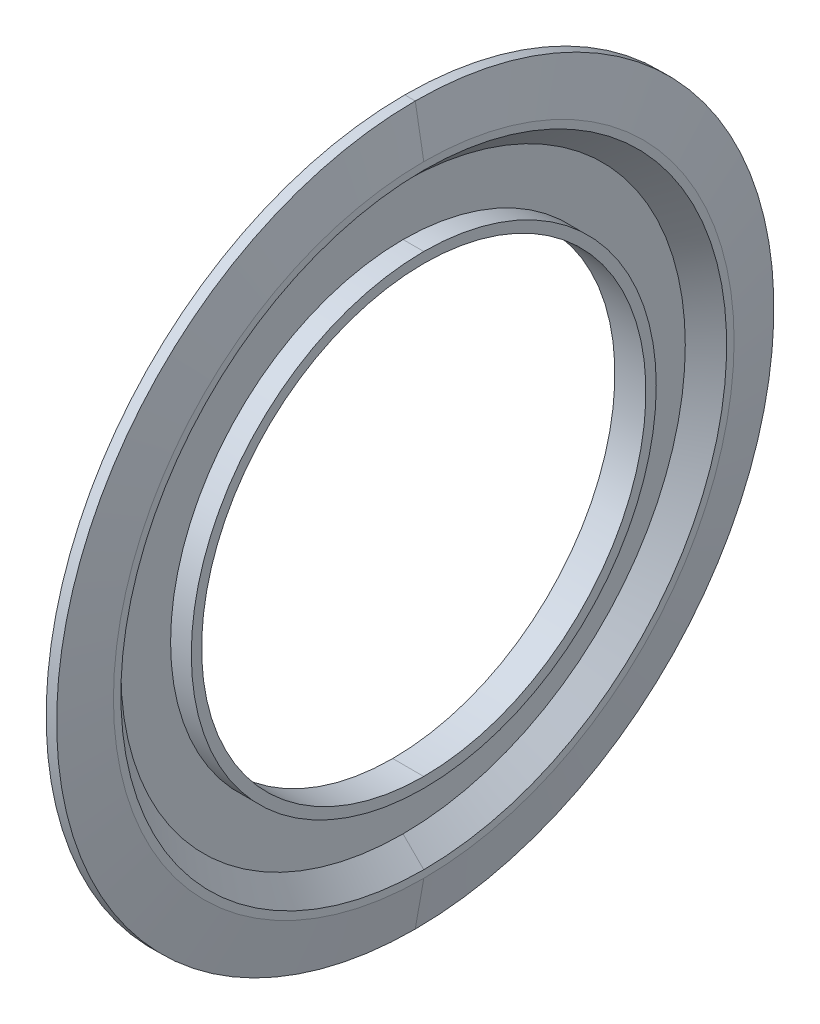
ISO-10303-21;
HEADER;
FILE_DESCRIPTION(('STEP AP214'),'2;1');
FILE_NAME('part.step','',(''),(''),'','','');
FILE_SCHEMA(('AUTOMOTIVE_DESIGN { 1 0 10303 214 1 1 1 1 }'));
ENDSEC;
DATA;
#1=APPLICATION_CONTEXT('core data for automotive mechanical design processes');
#2=APPLICATION_PROTOCOL_DEFINITION('international standard','automotive_design',2000,#1);
#3=PRODUCT_CONTEXT('',#1,'mechanical');
#4=PRODUCT('Part','Part','',(#3));
#5=PRODUCT_RELATED_PRODUCT_CATEGORY('part','',(#4));
#6=PRODUCT_DEFINITION_FORMATION('','',#4);
#7=PRODUCT_DEFINITION_CONTEXT('part definition',#1,'design');
#8=PRODUCT_DEFINITION('design','',#6,#7);
#9=PRODUCT_DEFINITION_SHAPE('','',#8);
#10=(LENGTH_UNIT() NAMED_UNIT(*) SI_UNIT(.MILLI.,.METRE.));
#11=(NAMED_UNIT(*) PLANE_ANGLE_UNIT() SI_UNIT($,.RADIAN.));
#12=(NAMED_UNIT(*) SI_UNIT($,.STERADIAN.) SOLID_ANGLE_UNIT());
#13=UNCERTAINTY_MEASURE_WITH_UNIT(LENGTH_MEASURE(1.E-05),#10,'distance_accuracy_value','');
#14=(GEOMETRIC_REPRESENTATION_CONTEXT(3) GLOBAL_UNCERTAINTY_ASSIGNED_CONTEXT((#13)) GLOBAL_UNIT_ASSIGNED_CONTEXT((#10,
#11,#12)) REPRESENTATION_CONTEXT('',''));
#15=CARTESIAN_POINT('',(0.,0.,0.));
#16=DIRECTION('',(0.,0.,1.));
#17=DIRECTION('',(1.,0.,0.));
#18=AXIS2_PLACEMENT_3D('',#15,#16,#17);
#19=CARTESIAN_POINT('',(0.762871315483505,5.78,0.));
#20=DIRECTION('',(1.,0.,0.));
#21=DIRECTION('',(0.,0.,1.));
#22=AXIS2_PLACEMENT_3D('',#19,#20,#21);
#23=PLANE('',#22);
#24=CARTESIAN_POINT('',(0.762871315483505,0.,0.));
#25=DIRECTION('',(-1.,0.,0.));
#26=DIRECTION('',(0.,1.,0.));
#27=AXIS2_PLACEMENT_3D('',#24,#25,#26);
#28=CIRCLE('',#27,5.71);
#29=CARTESIAN_POINT('',(0.762871315483505,5.71,0.));
#30=VERTEX_POINT('',#29);
#31=CARTESIAN_POINT('',(0.762871315483505,-5.71,0.));
#32=VERTEX_POINT('',#31);
#33=EDGE_CURVE('E11',#30,#32,#28,.T.);
#34=ORIENTED_EDGE('',*,*,#33,.T.);
#35=CARTESIAN_POINT('',(0.762871315483505,0.,0.));
#36=DIRECTION('',(-1.,0.,0.));
#37=DIRECTION('',(0.,1.,0.));
#38=AXIS2_PLACEMENT_3D('',#35,#36,#37);
#39=CIRCLE('',#38,5.71);
#40=EDGE_CURVE('E110',#32,#30,#39,.T.);
#41=ORIENTED_EDGE('',*,*,#40,.T.);
#42=EDGE_LOOP('',(#34,#41));
#43=FACE_BOUND('',#42,.T.);
#44=CARTESIAN_POINT('',(0.762871315483505,0.,0.));
#45=DIRECTION('',(-1.,0.,0.));
#46=DIRECTION('',(0.,1.,0.));
#47=AXIS2_PLACEMENT_3D('',#44,#45,#46);
#48=CIRCLE('',#47,5.85);
#49=CARTESIAN_POINT('',(0.762871315483505,5.85,0.));
#50=VERTEX_POINT('',#49);
#51=CARTESIAN_POINT('',(0.762871315483505,-5.85,0.));
#52=VERTEX_POINT('',#51);
#53=EDGE_CURVE('E188',#50,#52,#48,.T.);
#54=ORIENTED_EDGE('',*,*,#53,.F.);
#55=CARTESIAN_POINT('',(0.762871315483505,0.,0.));
#56=DIRECTION('',(-1.,0.,0.));
#57=DIRECTION('',(0.,1.,0.));
#58=AXIS2_PLACEMENT_3D('',#55,#56,#57);
#59=CIRCLE('',#58,5.85);
#60=EDGE_CURVE('E30',#52,#50,#59,.T.);
#61=ORIENTED_EDGE('',*,*,#60,.F.);
#62=EDGE_LOOP('',(#54,#61));
#63=FACE_BOUND('',#62,.T.);
#64=ADVANCED_FACE('F16',(#43,#63),#23,.T.);
#65=CARTESIAN_POINT('',(0.567871315483504,0.,0.));
#66=DIRECTION('',(1.,0.,0.));
#67=DIRECTION('',(0.,1.,0.));
#68=AXIS2_PLACEMENT_3D('',#65,#66,#67);
#69=CONICAL_SURFACE('',#68,5.515,0.785398163397448);
#70=DIRECTION('',(-0.707106781186548,-0.707106781186547,0.));
#71=VECTOR('',#70,1.);
#72=CARTESIAN_POINT('',(0.567871315483504,5.515,0.));
#73=LINE('',#72,#71);
#74=CARTESIAN_POINT('',(0.372871315483505,5.32,0.));
#75=VERTEX_POINT('',#74);
#76=EDGE_CURVE('E105',#30,#75,#73,.T.);
#77=ORIENTED_EDGE('',*,*,#76,.T.);
#78=CARTESIAN_POINT('',(0.372871315483505,0.,0.));
#79=DIRECTION('',(-1.,0.,0.));
#80=DIRECTION('',(0.,1.,0.));
#81=AXIS2_PLACEMENT_3D('',#78,#79,#80);
#82=CIRCLE('',#81,5.32);
#83=CARTESIAN_POINT('',(0.372871315483505,-5.32,0.));
#84=VERTEX_POINT('',#83);
#85=EDGE_CURVE('E19',#75,#84,#82,.T.);
#86=ORIENTED_EDGE('',*,*,#85,.T.);
#87=DIRECTION('',(0.707106781186548,-0.707106781186547,0.));
#88=VECTOR('',#87,1.);
#89=CARTESIAN_POINT('',(0.567871315483504,-5.515,0.));
#90=LINE('',#89,#88);
#91=EDGE_CURVE('E107',#84,#32,#90,.T.);
#92=ORIENTED_EDGE('',*,*,#91,.T.);
#93=ORIENTED_EDGE('',*,*,#33,.F.);
#94=EDGE_LOOP('',(#77,#86,#92,#93));
#95=FACE_BOUND('',#94,.T.);
#96=ADVANCED_FACE('F103',(#95),#69,.F.);
#97=CARTESIAN_POINT('',(0.372871315483504,4.85125,0.));
#98=DIRECTION('',(1.,0.,0.));
#99=DIRECTION('',(0.,-1.,0.));
#100=AXIS2_PLACEMENT_3D('',#97,#98,#99);
#101=PLANE('',#100);
#102=CARTESIAN_POINT('',(0.372871315483504,0.,0.));
#103=DIRECTION('',(-1.,0.,0.));
#104=DIRECTION('',(0.,1.,0.));
#105=AXIS2_PLACEMENT_3D('',#102,#103,#104);
#106=CIRCLE('',#105,4.3825);
#107=CARTESIAN_POINT('',(0.372871315483504,4.3825,0.));
#108=VERTEX_POINT('',#107);
#109=CARTESIAN_POINT('',(0.372871315483504,-4.3825,0.));
#110=VERTEX_POINT('',#109);
#111=EDGE_CURVE('E149',#108,#110,#106,.T.);
#112=ORIENTED_EDGE('',*,*,#111,.T.);
#113=CARTESIAN_POINT('',(0.372871315483504,0.,0.));
#114=DIRECTION('',(-1.,0.,0.));
#115=DIRECTION('',(0.,1.,0.));
#116=AXIS2_PLACEMENT_3D('',#113,#114,#115);
#117=CIRCLE('',#116,4.3825);
#118=EDGE_CURVE('E201',#110,#108,#117,.T.);
#119=ORIENTED_EDGE('',*,*,#118,.T.);
#120=EDGE_LOOP('',(#112,#119));
#121=FACE_BOUND('',#120,.T.);
#122=ORIENTED_EDGE('',*,*,#85,.F.);
#123=CARTESIAN_POINT('',(0.372871315483505,0.,0.));
#124=DIRECTION('',(-1.,0.,0.));
#125=DIRECTION('',(0.,1.,0.));
#126=AXIS2_PLACEMENT_3D('',#123,#124,#125);
#127=CIRCLE('',#126,5.32);
#128=EDGE_CURVE('E116',#84,#75,#127,.T.);
#129=ORIENTED_EDGE('',*,*,#128,.F.);
#130=EDGE_LOOP('',(#122,#129));
#131=FACE_BOUND('',#130,.T.);
#132=ADVANCED_FACE('F205',(#121,#131),#101,.T.);
#133=CARTESIAN_POINT('',(0.567871315483504,0.,0.));
#134=DIRECTION('',(-1.,0.,0.));
#135=DIRECTION('',(0.,1.,0.));
#136=AXIS2_PLACEMENT_3D('',#133,#134,#135);
#137=CYLINDRICAL_SURFACE('',#136,4.3825);
#138=DIRECTION('',(-1.,0.,0.));
#139=VECTOR('',#138,1.);
#140=CARTESIAN_POINT('',(0.567871315483504,4.3825,0.));
#141=LINE('',#140,#139);
#142=CARTESIAN_POINT('',(0.762871315483505,4.3825,0.));
#143=VERTEX_POINT('',#142);
#144=EDGE_CURVE('E129',#143,#108,#141,.T.);
#145=ORIENTED_EDGE('',*,*,#144,.T.);
#146=ORIENTED_EDGE('',*,*,#118,.F.);
#147=DIRECTION('',(1.,0.,0.));
#148=VECTOR('',#147,1.);
#149=CARTESIAN_POINT('',(0.567871315483504,-4.3825,0.));
#150=LINE('',#149,#148);
#151=CARTESIAN_POINT('',(0.762871315483505,-4.3825,0.));
#152=VERTEX_POINT('',#151);
#153=EDGE_CURVE('E141',#110,#152,#150,.T.);
#154=ORIENTED_EDGE('',*,*,#153,.T.);
#155=CARTESIAN_POINT('',(0.762871315483505,0.,0.));
#156=DIRECTION('',(-1.,0.,0.));
#157=DIRECTION('',(0.,1.,0.));
#158=AXIS2_PLACEMENT_3D('',#155,#156,#157);
#159=CIRCLE('',#158,4.3825);
#160=EDGE_CURVE('E138',#152,#143,#159,.T.);
#161=ORIENTED_EDGE('',*,*,#160,.T.);
#162=EDGE_LOOP('',(#145,#146,#154,#161));
#163=FACE_BOUND('',#162,.T.);
#164=ADVANCED_FACE('F207',(#163),#137,.T.);
#165=CARTESIAN_POINT('',(0.762871315483505,4.285,0.));
#166=DIRECTION('',(1.,0.,0.));
#167=DIRECTION('',(0.,0.,1.));
#168=AXIS2_PLACEMENT_3D('',#165,#166,#167);
#169=PLANE('',#168);
#170=CARTESIAN_POINT('',(0.762871315483505,0.,0.));
#171=DIRECTION('',(-1.,0.,0.));
#172=DIRECTION('',(0.,1.,0.));
#173=AXIS2_PLACEMENT_3D('',#170,#171,#172);
#174=CIRCLE('',#173,4.1875);
#175=CARTESIAN_POINT('',(0.762871315483505,4.1875,0.));
#176=VERTEX_POINT('',#175);
#177=CARTESIAN_POINT('',(0.762871315483505,-4.1875,0.));
#178=VERTEX_POINT('',#177);
#179=EDGE_CURVE('E132',#176,#178,#174,.T.);
#180=ORIENTED_EDGE('',*,*,#179,.T.);
#181=CARTESIAN_POINT('',(0.762871315483505,0.,0.));
#182=DIRECTION('',(-1.,0.,0.));
#183=DIRECTION('',(0.,1.,0.));
#184=AXIS2_PLACEMENT_3D('',#181,#182,#183);
#185=CIRCLE('',#184,4.1875);
#186=EDGE_CURVE('E119',#178,#176,#185,.T.);
#187=ORIENTED_EDGE('',*,*,#186,.T.);
#188=EDGE_LOOP('',(#180,#187));
#189=FACE_BOUND('',#188,.T.);
#190=CARTESIAN_POINT('',(0.762871315483505,0.,0.));
#191=DIRECTION('',(-1.,0.,0.));
#192=DIRECTION('',(0.,1.,0.));
#193=AXIS2_PLACEMENT_3D('',#190,#191,#192);
#194=CIRCLE('',#193,4.3825);
#195=EDGE_CURVE('E136',#143,#152,#194,.T.);
#196=ORIENTED_EDGE('',*,*,#195,.F.);
#197=ORIENTED_EDGE('',*,*,#160,.F.);
#198=EDGE_LOOP('',(#196,#197));
#199=FACE_BOUND('',#198,.T.);
#200=ADVANCED_FACE('F214',(#189,#199),#169,.T.);
#201=CARTESIAN_POINT('',(0.470371315483504,0.,0.));
#202=DIRECTION('',(-1.,0.,0.));
#203=DIRECTION('',(0.,1.,0.));
#204=AXIS2_PLACEMENT_3D('',#201,#202,#203);
#205=CYLINDRICAL_SURFACE('',#204,4.1875);
#206=DIRECTION('',(-1.,0.,0.));
#207=VECTOR('',#206,1.);
#208=CARTESIAN_POINT('',(0.470371315483504,4.1875,0.));
#209=LINE('',#208,#207);
#210=CARTESIAN_POINT('',(0.177871315483505,4.1875,0.));
#211=VERTEX_POINT('',#210);
#212=EDGE_CURVE('E123',#176,#211,#209,.T.);
#213=ORIENTED_EDGE('',*,*,#212,.T.);
#214=CARTESIAN_POINT('',(0.177871315483505,0.,0.));
#215=DIRECTION('',(-1.,0.,0.));
#216=DIRECTION('',(0.,1.,0.));
#217=AXIS2_PLACEMENT_3D('',#214,#215,#216);
#218=CIRCLE('',#217,4.1875);
#219=CARTESIAN_POINT('',(0.177871315483505,-4.1875,0.));
#220=VERTEX_POINT('',#219);
#221=EDGE_CURVE('E130',#211,#220,#218,.T.);
#222=ORIENTED_EDGE('',*,*,#221,.T.);
#223=DIRECTION('',(1.,0.,0.));
#224=VECTOR('',#223,1.);
#225=CARTESIAN_POINT('',(0.470371315483504,-4.1875,0.));
#226=LINE('',#225,#224);
#227=EDGE_CURVE('E122',#220,#178,#226,.T.);
#228=ORIENTED_EDGE('',*,*,#227,.T.);
#229=ORIENTED_EDGE('',*,*,#179,.F.);
#230=EDGE_LOOP('',(#213,#222,#228,#229));
#231=FACE_BOUND('',#230,.T.);
#232=ADVANCED_FACE('F249',(#231),#205,.F.);
#233=CARTESIAN_POINT('',(0.177871315483505,4.79413582233138,0.));
#234=DIRECTION('',(-1.,0.,0.));
#235=DIRECTION('',(0.,0.,1.));
#236=AXIS2_PLACEMENT_3D('',#233,#234,#235);
#237=PLANE('',#236);
#238=ORIENTED_EDGE('',*,*,#221,.F.);
#239=CARTESIAN_POINT('',(0.177871315483505,0.,0.));
#240=DIRECTION('',(-1.,0.,0.));
#241=DIRECTION('',(0.,1.,0.));
#242=AXIS2_PLACEMENT_3D('',#239,#240,#241);
#243=CIRCLE('',#242,4.1875);
#244=EDGE_CURVE('E127',#220,#211,#243,.T.);
#245=ORIENTED_EDGE('',*,*,#244,.F.);
#246=EDGE_LOOP('',(#238,#245));
#247=FACE_BOUND('',#246,.T.);
#248=CARTESIAN_POINT('',(0.177871315483505,0.,0.));
#249=DIRECTION('',(-1.,0.,0.));
#250=DIRECTION('',(0.,1.,0.));
#251=AXIS2_PLACEMENT_3D('',#248,#249,#250);
#252=CIRCLE('',#251,5.40077164466275);
#253=CARTESIAN_POINT('',(0.177871315483505,5.40077164466275,0.));
#254=VERTEX_POINT('',#253);
#255=CARTESIAN_POINT('',(0.177871315483505,-5.40077164466275,0.));
#256=VERTEX_POINT('',#255);
#257=EDGE_CURVE('E152',#254,#256,#252,.T.);
#258=ORIENTED_EDGE('',*,*,#257,.T.);
#259=CARTESIAN_POINT('',(0.177871315483505,0.,0.));
#260=DIRECTION('',(-1.,0.,0.));
#261=DIRECTION('',(0.,1.,0.));
#262=AXIS2_PLACEMENT_3D('',#259,#260,#261);
#263=CIRCLE('',#262,5.40077164466275);
#264=EDGE_CURVE('E133',#256,#254,#263,.T.);
#265=ORIENTED_EDGE('',*,*,#264,.T.);
#266=EDGE_LOOP('',(#258,#265));
#267=FACE_BOUND('',#266,.T.);
#268=ADVANCED_FACE('F259',(#247,#267),#237,.T.);
#269=CARTESIAN_POINT('',(0.372871315483505,0.,0.));
#270=DIRECTION('',(1.,0.,0.));
#271=DIRECTION('',(0.,1.,0.));
#272=AXIS2_PLACEMENT_3D('',#269,#270,#271);
#273=CONICAL_SURFACE('',#272,5.59577164466275,0.785398163397448);
#274=DIRECTION('',(-0.707106781186548,-0.707106781186547,0.));
#275=VECTOR('',#274,1.);
#276=CARTESIAN_POINT('',(0.372871315483505,5.59577164466275,0.));
#277=LINE('',#276,#275);
#278=CARTESIAN_POINT('',(0.567871315483504,5.79077164466275,0.));
#279=VERTEX_POINT('',#278);
#280=EDGE_CURVE('E146',#279,#254,#277,.T.);
#281=ORIENTED_EDGE('',*,*,#280,.T.);
#282=ORIENTED_EDGE('',*,*,#264,.F.);
#283=DIRECTION('',(0.707106781186548,-0.707106781186547,0.));
#284=VECTOR('',#283,1.);
#285=CARTESIAN_POINT('',(0.372871315483505,-5.59577164466275,0.));
#286=LINE('',#285,#284);
#287=CARTESIAN_POINT('',(0.567871315483504,-5.79077164466275,0.));
#288=VERTEX_POINT('',#287);
#289=EDGE_CURVE('E145',#256,#288,#286,.T.);
#290=ORIENTED_EDGE('',*,*,#289,.T.);
#291=CARTESIAN_POINT('',(0.567871315483504,0.,0.));
#292=DIRECTION('',(-1.,0.,0.));
#293=DIRECTION('',(0.,1.,0.));
#294=AXIS2_PLACEMENT_3D('',#291,#292,#293);
#295=CIRCLE('',#294,5.79077164466275);
#296=EDGE_CURVE('E198',#288,#279,#295,.T.);
#297=ORIENTED_EDGE('',*,*,#296,.T.);
#298=EDGE_LOOP('',(#281,#282,#290,#297));
#299=FACE_BOUND('',#298,.T.);
#300=ADVANCED_FACE('F269',(#299),#273,.T.);
#301=CARTESIAN_POINT('',(0.567871315483504,5.8118556776376,0.));
#302=DIRECTION('',(-1.,0.,0.));
#303=DIRECTION('',(0.,1.,0.));
#304=AXIS2_PLACEMENT_3D('',#301,#302,#303);
#305=PLANE('',#304);
#306=CARTESIAN_POINT('',(0.567871315483504,0.,0.));
#307=DIRECTION('',(-1.,0.,0.));
#308=DIRECTION('',(0.,1.,0.));
#309=AXIS2_PLACEMENT_3D('',#306,#307,#308);
#310=CIRCLE('',#309,5.79077164466275);
#311=EDGE_CURVE('E142',#279,#288,#310,.T.);
#312=ORIENTED_EDGE('',*,*,#311,.F.);
#313=ORIENTED_EDGE('',*,*,#296,.F.);
#314=EDGE_LOOP('',(#312,#313));
#315=FACE_BOUND('',#314,.T.);
#316=CARTESIAN_POINT('',(0.567871315483504,0.,0.));
#317=DIRECTION('',(-1.,0.,0.));
#318=DIRECTION('',(0.,1.,0.));
#319=AXIS2_PLACEMENT_3D('',#316,#317,#318);
#320=CIRCLE('',#319,5.83293971061244);
#321=CARTESIAN_POINT('',(0.567871315483504,5.83293971061244,0.));
#322=VERTEX_POINT('',#321);
#323=CARTESIAN_POINT('',(0.567871315483504,-5.83293971061244,0.));
#324=VERTEX_POINT('',#323);
#325=EDGE_CURVE('E196',#322,#324,#320,.T.);
#326=ORIENTED_EDGE('',*,*,#325,.T.);
#327=CARTESIAN_POINT('',(0.567871315483504,0.,0.));
#328=DIRECTION('',(-1.,0.,0.));
#329=DIRECTION('',(0.,1.,0.));
#330=AXIS2_PLACEMENT_3D('',#327,#328,#329);
#331=CIRCLE('',#330,5.83293971061244);
#332=EDGE_CURVE('E166',#324,#322,#331,.T.);
#333=ORIENTED_EDGE('',*,*,#332,.T.);
#334=EDGE_LOOP('',(#326,#333));
#335=FACE_BOUND('',#334,.T.);
#336=ADVANCED_FACE('F279',(#315,#335),#305,.T.);
#337=CARTESIAN_POINT('',(0.486138444602293,0.,0.));
#338=DIRECTION('',(-1.,0.,0.));
#339=DIRECTION('',(0.,1.,0.));
#340=AXIS2_PLACEMENT_3D('',#337,#338,#339);
#341=CONICAL_SURFACE('',#340,6.29646985530622,1.39626340159546);
#342=DIRECTION('',(-0.17364817766693,0.984807753012208,0.));
#343=VECTOR('',#342,1.);
#344=CARTESIAN_POINT('',(0.486138444602293,6.29646985530622,0.));
#345=LINE('',#344,#343);
#346=CARTESIAN_POINT('',(0.404405573721081,6.76,0.));
#347=VERTEX_POINT('',#346);
#348=EDGE_CURVE('E163',#322,#347,#345,.T.);
#349=ORIENTED_EDGE('',*,*,#348,.T.);
#350=CARTESIAN_POINT('',(0.404405573721081,0.,0.));
#351=DIRECTION('',(-1.,0.,0.));
#352=DIRECTION('',(0.,1.,0.));
#353=AXIS2_PLACEMENT_3D('',#350,#351,#352);
#354=CIRCLE('',#353,6.76);
#355=CARTESIAN_POINT('',(0.404405573721081,-6.76,0.));
#356=VERTEX_POINT('',#355);
#357=EDGE_CURVE('E184',#347,#356,#354,.T.);
#358=ORIENTED_EDGE('',*,*,#357,.T.);
#359=DIRECTION('',(0.17364817766693,0.984807753012208,0.));
#360=VECTOR('',#359,1.);
#361=CARTESIAN_POINT('',(0.486138444602293,-6.29646985530622,0.));
#362=LINE('',#361,#360);
#363=EDGE_CURVE('E169',#356,#324,#362,.T.);
#364=ORIENTED_EDGE('',*,*,#363,.T.);
#365=ORIENTED_EDGE('',*,*,#325,.F.);
#366=EDGE_LOOP('',(#349,#358,#364,#365));
#367=FACE_BOUND('',#366,.T.);
#368=ADVANCED_FACE('F288',(#367),#341,.F.);
#369=CARTESIAN_POINT('',(0.503409668379941,0.,0.));
#370=DIRECTION('',(-1.,0.,0.));
#371=DIRECTION('',(0.,1.,0.));
#372=AXIS2_PLACEMENT_3D('',#369,#370,#371);
#373=CYLINDRICAL_SURFACE('',#372,6.76);
#374=DIRECTION('',(-1.,0.,0.));
#375=VECTOR('',#374,1.);
#376=CARTESIAN_POINT('',(0.503409668379941,6.76,0.));
#377=LINE('',#376,#375);
#378=CARTESIAN_POINT('',(0.602413763038801,6.76,0.));
#379=VERTEX_POINT('',#378);
#380=EDGE_CURVE('E175',#379,#347,#377,.T.);
#381=ORIENTED_EDGE('',*,*,#380,.T.);
#382=CARTESIAN_POINT('',(0.404405573721081,0.,0.));
#383=DIRECTION('',(-1.,0.,0.));
#384=DIRECTION('',(0.,1.,0.));
#385=AXIS2_PLACEMENT_3D('',#382,#383,#384);
#386=CIRCLE('',#385,6.76);
#387=EDGE_CURVE('E172',#356,#347,#386,.T.);
#388=ORIENTED_EDGE('',*,*,#387,.F.);
#389=DIRECTION('',(1.,0.,0.));
#390=VECTOR('',#389,1.);
#391=CARTESIAN_POINT('',(0.503409668379941,-6.76,0.));
#392=LINE('',#391,#390);
#393=CARTESIAN_POINT('',(0.602413763038801,-6.76,0.));
#394=VERTEX_POINT('',#393);
#395=EDGE_CURVE('E181',#356,#394,#392,.T.);
#396=ORIENTED_EDGE('',*,*,#395,.T.);
#397=CARTESIAN_POINT('',(0.602413763038801,0.,0.));
#398=DIRECTION('',(-1.,0.,0.));
#399=DIRECTION('',(0.,1.,0.));
#400=AXIS2_PLACEMENT_3D('',#397,#398,#399);
#401=CIRCLE('',#400,6.76);
#402=EDGE_CURVE('E193',#394,#379,#401,.T.);
#403=ORIENTED_EDGE('',*,*,#402,.T.);
#404=EDGE_LOOP('',(#381,#388,#396,#403));
#405=FACE_BOUND('',#404,.T.);
#406=ADVANCED_FACE('F298',(#405),#373,.T.);
#407=CARTESIAN_POINT('',(0.682642539261153,0.,0.));
#408=DIRECTION('',(-1.,0.,0.));
#409=DIRECTION('',(0.,1.,0.));
#410=AXIS2_PLACEMENT_3D('',#407,#408,#409);
#411=CONICAL_SURFACE('',#410,6.305,1.39626340159546);
#412=DIRECTION('',(-0.173648177666931,0.984807753012208,0.));
#413=VECTOR('',#412,1.);
#414=CARTESIAN_POINT('',(0.682642539261153,6.305,0.));
#415=LINE('',#414,#413);
#416=EDGE_CURVE('E186',#50,#379,#415,.T.);
#417=ORIENTED_EDGE('',*,*,#416,.T.);
#418=ORIENTED_EDGE('',*,*,#402,.F.);
#419=DIRECTION('',(0.173648177666931,0.984807753012208,0.));
#420=VECTOR('',#419,1.);
#421=CARTESIAN_POINT('',(0.682642539261153,-6.305,0.));
#422=LINE('',#421,#420);
#423=EDGE_CURVE('E191',#394,#52,#422,.T.);
#424=ORIENTED_EDGE('',*,*,#423,.T.);
#425=ORIENTED_EDGE('',*,*,#60,.T.);
#426=EDGE_LOOP('',(#417,#418,#424,#425));
#427=FACE_BOUND('',#426,.T.);
#428=ADVANCED_FACE('F308',(#427),#411,.T.);
#429=CARTESIAN_POINT('',(0.682642539261153,0.,0.));
#430=DIRECTION('',(-1.,0.,0.));
#431=DIRECTION('',(0.,1.,0.));
#432=AXIS2_PLACEMENT_3D('',#429,#430,#431);
#433=CONICAL_SURFACE('',#432,6.305,1.39626340159546);
#434=ORIENTED_EDGE('',*,*,#416,.F.);
#435=ORIENTED_EDGE('',*,*,#53,.T.);
#436=ORIENTED_EDGE('',*,*,#423,.F.);
#437=CARTESIAN_POINT('',(0.602413763038801,0.,0.));
#438=DIRECTION('',(-1.,0.,0.));
#439=DIRECTION('',(0.,1.,0.));
#440=AXIS2_PLACEMENT_3D('',#437,#438,#439);
#441=CIRCLE('',#440,6.76);
#442=EDGE_CURVE('E178',#379,#394,#441,.T.);
#443=ORIENTED_EDGE('',*,*,#442,.F.);
#444=EDGE_LOOP('',(#434,#435,#436,#443));
#445=FACE_BOUND('',#444,.T.);
#446=ADVANCED_FACE('F318',(#445),#433,.T.);
#447=CARTESIAN_POINT('',(0.503409668379941,0.,0.));
#448=DIRECTION('',(-1.,0.,0.));
#449=DIRECTION('',(0.,1.,0.));
#450=AXIS2_PLACEMENT_3D('',#447,#448,#449);
#451=CYLINDRICAL_SURFACE('',#450,6.76);
#452=ORIENTED_EDGE('',*,*,#380,.F.);
#453=ORIENTED_EDGE('',*,*,#442,.T.);
#454=ORIENTED_EDGE('',*,*,#395,.F.);
#455=ORIENTED_EDGE('',*,*,#357,.F.);
#456=EDGE_LOOP('',(#452,#453,#454,#455));
#457=FACE_BOUND('',#456,.T.);
#458=ADVANCED_FACE('F327',(#457),#451,.T.);
#459=CARTESIAN_POINT('',(0.486138444602293,0.,0.));
#460=DIRECTION('',(-1.,0.,0.));
#461=DIRECTION('',(0.,1.,0.));
#462=AXIS2_PLACEMENT_3D('',#459,#460,#461);
#463=CONICAL_SURFACE('',#462,6.29646985530622,1.39626340159546);
#464=ORIENTED_EDGE('',*,*,#348,.F.);
#465=ORIENTED_EDGE('',*,*,#332,.F.);
#466=ORIENTED_EDGE('',*,*,#363,.F.);
#467=ORIENTED_EDGE('',*,*,#387,.T.);
#468=EDGE_LOOP('',(#464,#465,#466,#467));
#469=FACE_BOUND('',#468,.T.);
#470=ADVANCED_FACE('F337',(#469),#463,.F.);
#471=CARTESIAN_POINT('',(0.372871315483505,0.,0.));
#472=DIRECTION('',(1.,0.,0.));
#473=DIRECTION('',(0.,1.,0.));
#474=AXIS2_PLACEMENT_3D('',#471,#472,#473);
#475=CONICAL_SURFACE('',#474,5.59577164466275,0.785398163397448);
#476=ORIENTED_EDGE('',*,*,#280,.F.);
#477=ORIENTED_EDGE('',*,*,#311,.T.);
#478=ORIENTED_EDGE('',*,*,#289,.F.);
#479=ORIENTED_EDGE('',*,*,#257,.F.);
#480=EDGE_LOOP('',(#476,#477,#478,#479));
#481=FACE_BOUND('',#480,.T.);
#482=ADVANCED_FACE('F347',(#481),#475,.T.);
#483=CARTESIAN_POINT('',(0.470371315483504,0.,0.));
#484=DIRECTION('',(-1.,0.,0.));
#485=DIRECTION('',(0.,1.,0.));
#486=AXIS2_PLACEMENT_3D('',#483,#484,#485);
#487=CYLINDRICAL_SURFACE('',#486,4.1875);
#488=ORIENTED_EDGE('',*,*,#212,.F.);
#489=ORIENTED_EDGE('',*,*,#186,.F.);
#490=ORIENTED_EDGE('',*,*,#227,.F.);
#491=ORIENTED_EDGE('',*,*,#244,.T.);
#492=EDGE_LOOP('',(#488,#489,#490,#491));
#493=FACE_BOUND('',#492,.T.);
#494=ADVANCED_FACE('F357',(#493),#487,.F.);
#495=CARTESIAN_POINT('',(0.567871315483504,0.,0.));
#496=DIRECTION('',(-1.,0.,0.));
#497=DIRECTION('',(0.,1.,0.));
#498=AXIS2_PLACEMENT_3D('',#495,#496,#497);
#499=CYLINDRICAL_SURFACE('',#498,4.3825);
#500=ORIENTED_EDGE('',*,*,#144,.F.);
#501=ORIENTED_EDGE('',*,*,#195,.T.);
#502=ORIENTED_EDGE('',*,*,#153,.F.);
#503=ORIENTED_EDGE('',*,*,#111,.F.);
#504=EDGE_LOOP('',(#500,#501,#502,#503));
#505=FACE_BOUND('',#504,.T.);
#506=ADVANCED_FACE('F367',(#505),#499,.T.);
#507=CARTESIAN_POINT('',(0.567871315483504,0.,0.));
#508=DIRECTION('',(1.,0.,0.));
#509=DIRECTION('',(0.,1.,0.));
#510=AXIS2_PLACEMENT_3D('',#507,#508,#509);
#511=CONICAL_SURFACE('',#510,5.515,0.785398163397448);
#512=ORIENTED_EDGE('',*,*,#76,.F.);
#513=ORIENTED_EDGE('',*,*,#40,.F.);
#514=ORIENTED_EDGE('',*,*,#91,.F.);
#515=ORIENTED_EDGE('',*,*,#128,.T.);
#516=EDGE_LOOP('',(#512,#513,#514,#515));
#517=FACE_BOUND('',#516,.T.);
#518=ADVANCED_FACE('F114',(#517),#511,.F.);
#519=CLOSED_SHELL('',(#64,#96,#132,#164,#200,#232,#268,#300,#336,#368,#406,#428,#446,#458,#470,
#482,#494,#506,#518));
#520=MANIFOLD_SOLID_BREP('B1',#519);
#521=ADVANCED_BREP_SHAPE_REPRESENTATION('',(#18,#520),#14);
#522=SHAPE_DEFINITION_REPRESENTATION(#9,#521);
ENDSEC;
END-ISO-10303-21;
